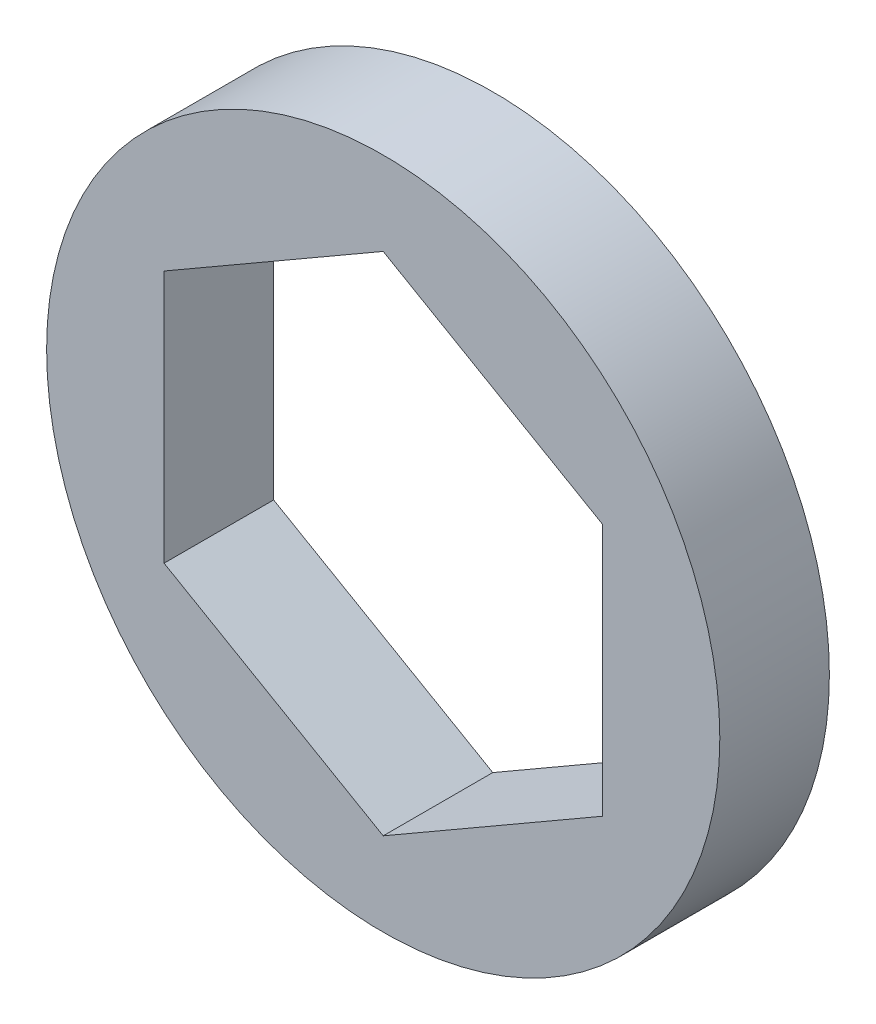
ISO-10303-21;
HEADER;
FILE_DESCRIPTION(('STEP AP214'),'2;1');
FILE_NAME('part.step','',(''),(''),'','','');
FILE_SCHEMA(('AUTOMOTIVE_DESIGN { 1 0 10303 214 1 1 1 1 }'));
ENDSEC;
DATA;
#1=APPLICATION_CONTEXT('core data for automotive mechanical design processes');
#2=APPLICATION_PROTOCOL_DEFINITION('international standard','automotive_design',2000,#1);
#3=PRODUCT_CONTEXT('',#1,'mechanical');
#4=PRODUCT('Part','Part','',(#3));
#5=PRODUCT_RELATED_PRODUCT_CATEGORY('part','',(#4));
#6=PRODUCT_DEFINITION_FORMATION('','',#4);
#7=PRODUCT_DEFINITION_CONTEXT('part definition',#1,'design');
#8=PRODUCT_DEFINITION('design','',#6,#7);
#9=PRODUCT_DEFINITION_SHAPE('','',#8);
#10=(LENGTH_UNIT() NAMED_UNIT(*) SI_UNIT(.MILLI.,.METRE.));
#11=(NAMED_UNIT(*) PLANE_ANGLE_UNIT() SI_UNIT($,.RADIAN.));
#12=(NAMED_UNIT(*) SI_UNIT($,.STERADIAN.) SOLID_ANGLE_UNIT());
#13=UNCERTAINTY_MEASURE_WITH_UNIT(LENGTH_MEASURE(1.E-05),#10,'distance_accuracy_value','');
#14=(GEOMETRIC_REPRESENTATION_CONTEXT(3) GLOBAL_UNCERTAINTY_ASSIGNED_CONTEXT((#13)) GLOBAL_UNIT_ASSIGNED_CONTEXT((#10,
#11,#12)) REPRESENTATION_CONTEXT('',''));
#15=CARTESIAN_POINT('',(0.,0.,0.));
#16=DIRECTION('',(0.,0.,1.));
#17=DIRECTION('',(1.,0.,0.));
#18=AXIS2_PLACEMENT_3D('',#15,#16,#17);
#19=CARTESIAN_POINT('',(0.,0.,3.175));
#20=DIRECTION('',(0.,0.,1.));
#21=DIRECTION('',(1.,0.,0.));
#22=AXIS2_PLACEMENT_3D('',#19,#20,#21);
#23=PLANE('',#22);
#24=CARTESIAN_POINT('',(0.,0.,3.175));
#25=DIRECTION('',(0.,0.,1.));
#26=DIRECTION('',(1.,0.,0.));
#27=AXIS2_PLACEMENT_3D('',#24,#25,#26);
#28=CIRCLE('',#27,9.7536);
#29=CARTESIAN_POINT('',(9.7536,0.,3.175));
#30=VERTEX_POINT('',#29);
#31=EDGE_CURVE('E11',#30,#30,#28,.T.);
#32=ORIENTED_EDGE('',*,*,#31,.T.);
#33=EDGE_LOOP('',(#32));
#34=FACE_BOUND('',#33,.T.);
#35=DIRECTION('',(0.,-1.,0.));
#36=VECTOR('',#35,1.);
#37=CARTESIAN_POINT('',(-6.35,3.66617420935412,3.175));
#38=LINE('',#37,#36);
#39=CARTESIAN_POINT('',(-6.35,3.66617420935412,3.175));
#40=VERTEX_POINT('',#39);
#41=CARTESIAN_POINT('',(-6.35,-3.66617420935412,3.175));
#42=VERTEX_POINT('',#41);
#43=EDGE_CURVE('E119',#40,#42,#38,.T.);
#44=ORIENTED_EDGE('',*,*,#43,.F.);
#45=DIRECTION('',(-0.866025403784439,-0.5,0.));
#46=VECTOR('',#45,1.);
#47=CARTESIAN_POINT('',(0.,7.33234841870825,3.175));
#48=LINE('',#47,#46);
#49=CARTESIAN_POINT('',(0.,7.33234841870825,3.175));
#50=VERTEX_POINT('',#49);
#51=EDGE_CURVE('E110',#50,#40,#48,.T.);
#52=ORIENTED_EDGE('',*,*,#51,.F.);
#53=DIRECTION('',(-0.866025403784438,0.5,0.));
#54=VECTOR('',#53,1.);
#55=CARTESIAN_POINT('',(6.35,3.66617420935412,3.175));
#56=LINE('',#55,#54);
#57=CARTESIAN_POINT('',(6.35,3.66617420935412,3.175));
#58=VERTEX_POINT('',#57);
#59=EDGE_CURVE('E145',#58,#50,#56,.T.);
#60=ORIENTED_EDGE('',*,*,#59,.F.);
#61=DIRECTION('',(0.,1.,0.));
#62=VECTOR('',#61,1.);
#63=CARTESIAN_POINT('',(6.35,-3.66617420935412,3.175));
#64=LINE('',#63,#62);
#65=CARTESIAN_POINT('',(6.35,-3.66617420935412,3.175));
#66=VERTEX_POINT('',#65);
#67=EDGE_CURVE('E142',#66,#58,#64,.T.);
#68=ORIENTED_EDGE('',*,*,#67,.F.);
#69=DIRECTION('',(0.866025403784438,0.5,0.));
#70=VECTOR('',#69,1.);
#71=CARTESIAN_POINT('',(0.,-7.33234841870825,3.175));
#72=LINE('',#71,#70);
#73=CARTESIAN_POINT('',(0.,-7.33234841870825,3.175));
#74=VERTEX_POINT('',#73);
#75=EDGE_CURVE('E137',#74,#66,#72,.T.);
#76=ORIENTED_EDGE('',*,*,#75,.F.);
#77=DIRECTION('',(0.866025403784439,-0.5,0.));
#78=VECTOR('',#77,1.);
#79=CARTESIAN_POINT('',(-6.35,-3.66617420935412,3.175));
#80=LINE('',#79,#78);
#81=EDGE_CURVE('E132',#42,#74,#80,.T.);
#82=ORIENTED_EDGE('',*,*,#81,.F.);
#83=EDGE_LOOP('',(#44,#52,#60,#68,#76,#82));
#84=FACE_BOUND('',#83,.T.);
#85=ADVANCED_FACE('F44',(#34,#84),#23,.T.);
#86=CARTESIAN_POINT('',(0.,0.,0.));
#87=DIRECTION('',(0.,0.,1.));
#88=DIRECTION('',(1.,0.,0.));
#89=AXIS2_PLACEMENT_3D('',#86,#87,#88);
#90=PLANE('',#89);
#91=CARTESIAN_POINT('',(0.,0.,0.));
#92=DIRECTION('',(0.,0.,1.));
#93=DIRECTION('',(1.,0.,0.));
#94=AXIS2_PLACEMENT_3D('',#91,#92,#93);
#95=CIRCLE('',#94,9.7536);
#96=CARTESIAN_POINT('',(9.7536,0.,0.));
#97=VERTEX_POINT('',#96);
#98=EDGE_CURVE('E48',#97,#97,#95,.T.);
#99=ORIENTED_EDGE('',*,*,#98,.F.);
#100=EDGE_LOOP('',(#99));
#101=FACE_BOUND('',#100,.T.);
#102=DIRECTION('',(-0.866025403784439,-0.5,0.));
#103=VECTOR('',#102,1.);
#104=CARTESIAN_POINT('',(0.,7.33234841870825,0.));
#105=LINE('',#104,#103);
#106=CARTESIAN_POINT('',(0.,7.33234841870825,0.));
#107=VERTEX_POINT('',#106);
#108=CARTESIAN_POINT('',(-6.35,3.66617420935412,0.));
#109=VERTEX_POINT('',#108);
#110=EDGE_CURVE('E74',#107,#109,#105,.T.);
#111=ORIENTED_EDGE('',*,*,#110,.T.);
#112=DIRECTION('',(0.,-1.,0.));
#113=VECTOR('',#112,1.);
#114=CARTESIAN_POINT('',(-6.35,3.66617420935412,0.));
#115=LINE('',#114,#113);
#116=CARTESIAN_POINT('',(-6.35,-3.66617420935412,0.));
#117=VERTEX_POINT('',#116);
#118=EDGE_CURVE('E126',#109,#117,#115,.T.);
#119=ORIENTED_EDGE('',*,*,#118,.T.);
#120=DIRECTION('',(0.866025403784439,-0.5,0.));
#121=VECTOR('',#120,1.);
#122=CARTESIAN_POINT('',(-6.35,-3.66617420935412,0.));
#123=LINE('',#122,#121);
#124=CARTESIAN_POINT('',(0.,-7.33234841870825,0.));
#125=VERTEX_POINT('',#124);
#126=EDGE_CURVE('E152',#117,#125,#123,.T.);
#127=ORIENTED_EDGE('',*,*,#126,.T.);
#128=DIRECTION('',(0.866025403784438,0.5,0.));
#129=VECTOR('',#128,1.);
#130=CARTESIAN_POINT('',(0.,-7.33234841870825,0.));
#131=LINE('',#130,#129);
#132=CARTESIAN_POINT('',(6.35,-3.66617420935412,0.));
#133=VERTEX_POINT('',#132);
#134=EDGE_CURVE('E156',#125,#133,#131,.T.);
#135=ORIENTED_EDGE('',*,*,#134,.T.);
#136=DIRECTION('',(0.,1.,0.));
#137=VECTOR('',#136,1.);
#138=CARTESIAN_POINT('',(6.35,-3.66617420935412,0.));
#139=LINE('',#138,#137);
#140=CARTESIAN_POINT('',(6.35,3.66617420935412,0.));
#141=VERTEX_POINT('',#140);
#142=EDGE_CURVE('E160',#133,#141,#139,.T.);
#143=ORIENTED_EDGE('',*,*,#142,.T.);
#144=DIRECTION('',(-0.866025403784438,0.5,0.));
#145=VECTOR('',#144,1.);
#146=CARTESIAN_POINT('',(6.35,3.66617420935412,0.));
#147=LINE('',#146,#145);
#148=EDGE_CURVE('E120',#141,#107,#147,.T.);
#149=ORIENTED_EDGE('',*,*,#148,.T.);
#150=EDGE_LOOP('',(#111,#119,#127,#135,#143,#149));
#151=FACE_BOUND('',#150,.T.);
#152=ADVANCED_FACE('F187',(#101,#151),#90,.F.);
#153=CARTESIAN_POINT('',(0.,0.,3.175));
#154=DIRECTION('',(0.,0.,-1.));
#155=DIRECTION('',(-1.,0.,0.));
#156=AXIS2_PLACEMENT_3D('',#153,#154,#155);
#157=CYLINDRICAL_SURFACE('',#156,9.7536);
#158=ORIENTED_EDGE('',*,*,#31,.F.);
#159=EDGE_LOOP('',(#158));
#160=FACE_BOUND('',#159,.T.);
#161=ORIENTED_EDGE('',*,*,#98,.T.);
#162=EDGE_LOOP('',(#161));
#163=FACE_BOUND('',#162,.T.);
#164=ADVANCED_FACE('F46',(#160,#163),#157,.T.);
#165=CARTESIAN_POINT('',(0.,7.33234841870825,3.175));
#166=DIRECTION('',(0.5,-0.866025403784438,0.));
#167=DIRECTION('',(0.866025403784439,0.5,0.));
#168=AXIS2_PLACEMENT_3D('',#165,#166,#167);
#169=PLANE('',#168);
#170=ORIENTED_EDGE('',*,*,#110,.F.);
#171=DIRECTION('',(0.,0.,-1.));
#172=VECTOR('',#171,1.);
#173=CARTESIAN_POINT('',(0.,7.33234841870825,3.175));
#174=LINE('',#173,#172);
#175=EDGE_CURVE('E114',#50,#107,#174,.T.);
#176=ORIENTED_EDGE('',*,*,#175,.F.);
#177=ORIENTED_EDGE('',*,*,#51,.T.);
#178=DIRECTION('',(0.,0.,-1.));
#179=VECTOR('',#178,1.);
#180=CARTESIAN_POINT('',(-6.35,3.66617420935412,3.175));
#181=LINE('',#180,#179);
#182=EDGE_CURVE('E113',#40,#109,#181,.T.);
#183=ORIENTED_EDGE('',*,*,#182,.T.);
#184=EDGE_LOOP('',(#170,#176,#177,#183));
#185=FACE_BOUND('',#184,.T.);
#186=ADVANCED_FACE('F112',(#185),#169,.T.);
#187=CARTESIAN_POINT('',(-6.35,3.66617420935412,3.175));
#188=DIRECTION('',(1.,0.,0.));
#189=DIRECTION('',(0.,0.,-1.));
#190=AXIS2_PLACEMENT_3D('',#187,#188,#189);
#191=PLANE('',#190);
#192=ORIENTED_EDGE('',*,*,#118,.F.);
#193=ORIENTED_EDGE('',*,*,#182,.F.);
#194=ORIENTED_EDGE('',*,*,#43,.T.);
#195=DIRECTION('',(0.,0.,-1.));
#196=VECTOR('',#195,1.);
#197=CARTESIAN_POINT('',(-6.35,-3.66617420935412,3.175));
#198=LINE('',#197,#196);
#199=EDGE_CURVE('E128',#42,#117,#198,.T.);
#200=ORIENTED_EDGE('',*,*,#199,.T.);
#201=EDGE_LOOP('',(#192,#193,#194,#200));
#202=FACE_BOUND('',#201,.T.);
#203=ADVANCED_FACE('F123',(#202),#191,.T.);
#204=CARTESIAN_POINT('',(-6.35,-3.66617420935412,3.175));
#205=DIRECTION('',(0.5,0.866025403784439,0.));
#206=DIRECTION('',(-0.866025403784439,0.5,0.));
#207=AXIS2_PLACEMENT_3D('',#204,#205,#206);
#208=PLANE('',#207);
#209=ORIENTED_EDGE('',*,*,#126,.F.);
#210=ORIENTED_EDGE('',*,*,#199,.F.);
#211=ORIENTED_EDGE('',*,*,#81,.T.);
#212=DIRECTION('',(0.,0.,-1.));
#213=VECTOR('',#212,1.);
#214=CARTESIAN_POINT('',(0.,-7.33234841870825,3.175));
#215=LINE('',#214,#213);
#216=EDGE_CURVE('E174',#74,#125,#215,.T.);
#217=ORIENTED_EDGE('',*,*,#216,.T.);
#218=EDGE_LOOP('',(#209,#210,#211,#217));
#219=FACE_BOUND('',#218,.T.);
#220=ADVANCED_FACE('F183',(#219),#208,.T.);
#221=CARTESIAN_POINT('',(0.,-7.33234841870825,3.175));
#222=DIRECTION('',(-0.5,0.866025403784438,0.));
#223=DIRECTION('',(-0.866025403784439,-0.5,0.));
#224=AXIS2_PLACEMENT_3D('',#221,#222,#223);
#225=PLANE('',#224);
#226=ORIENTED_EDGE('',*,*,#134,.F.);
#227=ORIENTED_EDGE('',*,*,#216,.F.);
#228=ORIENTED_EDGE('',*,*,#75,.T.);
#229=DIRECTION('',(0.,0.,-1.));
#230=VECTOR('',#229,1.);
#231=CARTESIAN_POINT('',(6.35,-3.66617420935412,3.175));
#232=LINE('',#231,#230);
#233=EDGE_CURVE('E171',#66,#133,#232,.T.);
#234=ORIENTED_EDGE('',*,*,#233,.T.);
#235=EDGE_LOOP('',(#226,#227,#228,#234));
#236=FACE_BOUND('',#235,.T.);
#237=ADVANCED_FACE('F195',(#236),#225,.T.);
#238=CARTESIAN_POINT('',(6.35,-3.66617420935412,3.175));
#239=DIRECTION('',(-1.,0.,0.));
#240=DIRECTION('',(0.,-1.,0.));
#241=AXIS2_PLACEMENT_3D('',#238,#239,#240);
#242=PLANE('',#241);
#243=ORIENTED_EDGE('',*,*,#142,.F.);
#244=ORIENTED_EDGE('',*,*,#233,.F.);
#245=ORIENTED_EDGE('',*,*,#67,.T.);
#246=DIRECTION('',(0.,0.,-1.));
#247=VECTOR('',#246,1.);
#248=CARTESIAN_POINT('',(6.35,3.66617420935412,3.175));
#249=LINE('',#248,#247);
#250=EDGE_CURVE('E63',#58,#141,#249,.T.);
#251=ORIENTED_EDGE('',*,*,#250,.T.);
#252=EDGE_LOOP('',(#243,#244,#245,#251));
#253=FACE_BOUND('',#252,.T.);
#254=ADVANCED_FACE('F193',(#253),#242,.T.);
#255=CARTESIAN_POINT('',(6.35,3.66617420935412,3.175));
#256=DIRECTION('',(-0.5,-0.866025403784439,0.));
#257=DIRECTION('',(0.866025403784439,-0.5,0.));
#258=AXIS2_PLACEMENT_3D('',#255,#256,#257);
#259=PLANE('',#258);
#260=ORIENTED_EDGE('',*,*,#148,.F.);
#261=ORIENTED_EDGE('',*,*,#250,.F.);
#262=ORIENTED_EDGE('',*,*,#59,.T.);
#263=ORIENTED_EDGE('',*,*,#175,.T.);
#264=EDGE_LOOP('',(#260,#261,#262,#263));
#265=FACE_BOUND('',#264,.T.);
#266=ADVANCED_FACE('F189',(#265),#259,.T.);
#267=CLOSED_SHELL('',(#85,#152,#164,#186,#203,#220,#237,#254,#266));
#268=MANIFOLD_SOLID_BREP('B2',#267);
#269=ADVANCED_BREP_SHAPE_REPRESENTATION('',(#18,#268),#14);
#270=SHAPE_DEFINITION_REPRESENTATION(#9,#269);
ENDSEC;
END-ISO-10303-21;
